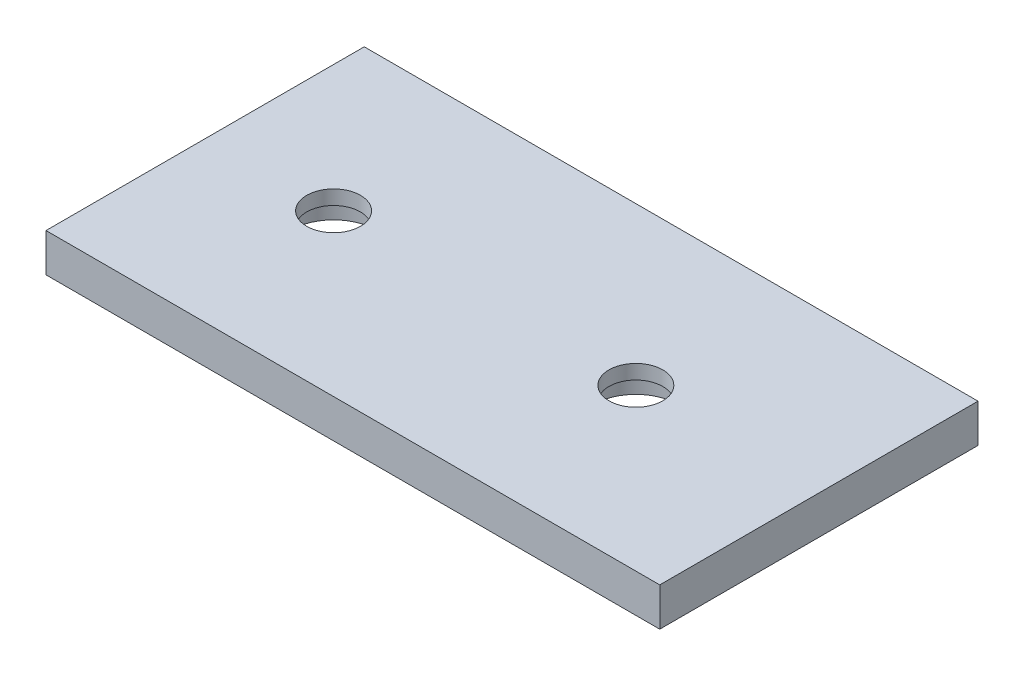
ISO-10303-21;
HEADER;
FILE_DESCRIPTION(('STEP AP214'),'2;1');
FILE_NAME('part.step','',(''),(''),'','','');
FILE_SCHEMA(('AUTOMOTIVE_DESIGN { 1 0 10303 214 1 1 1 1 }'));
ENDSEC;
DATA;
#1=APPLICATION_CONTEXT('core data for automotive mechanical design processes');
#2=APPLICATION_PROTOCOL_DEFINITION('international standard','automotive_design',2000,#1);
#3=PRODUCT_CONTEXT('',#1,'mechanical');
#4=PRODUCT('Part','Part','',(#3));
#5=PRODUCT_RELATED_PRODUCT_CATEGORY('part','',(#4));
#6=PRODUCT_DEFINITION_FORMATION('','',#4);
#7=PRODUCT_DEFINITION_CONTEXT('part definition',#1,'design');
#8=PRODUCT_DEFINITION('design','',#6,#7);
#9=PRODUCT_DEFINITION_SHAPE('','',#8);
#10=(LENGTH_UNIT() NAMED_UNIT(*) SI_UNIT(.MILLI.,.METRE.));
#11=(NAMED_UNIT(*) PLANE_ANGLE_UNIT() SI_UNIT($,.RADIAN.));
#12=(NAMED_UNIT(*) SI_UNIT($,.STERADIAN.) SOLID_ANGLE_UNIT());
#13=UNCERTAINTY_MEASURE_WITH_UNIT(LENGTH_MEASURE(1.E-05),#10,'distance_accuracy_value','');
#14=(GEOMETRIC_REPRESENTATION_CONTEXT(3) GLOBAL_UNCERTAINTY_ASSIGNED_CONTEXT((#13)) GLOBAL_UNIT_ASSIGNED_CONTEXT((#10,
#11,#12)) REPRESENTATION_CONTEXT('',''));
#15=CARTESIAN_POINT('',(0.,0.,0.));
#16=DIRECTION('',(0.,0.,1.));
#17=DIRECTION('',(1.,0.,0.));
#18=AXIS2_PLACEMENT_3D('',#15,#16,#17);
#19=CARTESIAN_POINT('',(61.1264723937618,12.7,0.));
#20=DIRECTION('',(1.,0.,0.));
#21=DIRECTION('',(0.,0.,-1.));
#22=AXIS2_PLACEMENT_3D('',#19,#20,#21);
#23=PLANE('',#22);
#24=DIRECTION('',(0.,0.,1.));
#25=VECTOR('',#24,1.);
#26=CARTESIAN_POINT('',(61.1264723937618,0.,0.));
#27=LINE('',#26,#25);
#28=CARTESIAN_POINT('',(61.1264723937618,0.,-52.0635569284407));
#29=VERTEX_POINT('',#28);
#30=CARTESIAN_POINT('',(61.1264723937618,0.,53.2205248601838));
#31=VERTEX_POINT('',#30);
#32=EDGE_CURVE('E108',#29,#31,#27,.T.);
#33=ORIENTED_EDGE('',*,*,#32,.F.);
#34=DIRECTION('',(0.,-1.,0.));
#35=VECTOR('',#34,1.);
#36=CARTESIAN_POINT('',(61.1264723937618,12.7,-52.0635569284407));
#37=LINE('',#36,#35);
#38=CARTESIAN_POINT('',(61.1264723937618,12.7,-52.0635569284407));
#39=VERTEX_POINT('',#38);
#40=EDGE_CURVE('E11',#39,#29,#37,.T.);
#41=ORIENTED_EDGE('',*,*,#40,.F.);
#42=DIRECTION('',(0.,0.,1.));
#43=VECTOR('',#42,1.);
#44=CARTESIAN_POINT('',(61.1264723937618,12.7,0.));
#45=LINE('',#44,#43);
#46=CARTESIAN_POINT('',(61.1264723937618,12.7,53.2205248601838));
#47=VERTEX_POINT('',#46);
#48=EDGE_CURVE('E101',#39,#47,#45,.T.);
#49=ORIENTED_EDGE('',*,*,#48,.T.);
#50=DIRECTION('',(0.,-1.,0.));
#51=VECTOR('',#50,1.);
#52=CARTESIAN_POINT('',(61.1264723937618,12.7,53.2205248601838));
#53=LINE('',#52,#51);
#54=EDGE_CURVE('E79',#47,#31,#53,.T.);
#55=ORIENTED_EDGE('',*,*,#54,.T.);
#56=EDGE_LOOP('',(#33,#41,#49,#55));
#57=FACE_BOUND('',#56,.T.);
#58=ADVANCED_FACE('F37',(#57),#23,.T.);
#59=CARTESIAN_POINT('',(0.,12.7,-52.0635569284407));
#60=DIRECTION('',(0.,0.,-1.));
#61=DIRECTION('',(-1.,0.,0.));
#62=AXIS2_PLACEMENT_3D('',#59,#60,#61);
#63=PLANE('',#62);
#64=DIRECTION('',(1.,0.,0.));
#65=VECTOR('',#64,1.);
#66=CARTESIAN_POINT('',(0.,0.,-52.0635569284407));
#67=LINE('',#66,#65);
#68=CARTESIAN_POINT('',(-141.921399627157,0.,-52.0635569284407));
#69=VERTEX_POINT('',#68);
#70=EDGE_CURVE('E91',#69,#29,#67,.T.);
#71=ORIENTED_EDGE('',*,*,#70,.F.);
#72=DIRECTION('',(0.,-1.,0.));
#73=VECTOR('',#72,1.);
#74=CARTESIAN_POINT('',(-141.921399627157,12.7,-52.0635569284407));
#75=LINE('',#74,#73);
#76=CARTESIAN_POINT('',(-141.921399627157,12.7,-52.0635569284407));
#77=VERTEX_POINT('',#76);
#78=EDGE_CURVE('E47',#77,#69,#75,.T.);
#79=ORIENTED_EDGE('',*,*,#78,.F.);
#80=DIRECTION('',(1.,0.,0.));
#81=VECTOR('',#80,1.);
#82=CARTESIAN_POINT('',(0.,12.7,-52.0635569284407));
#83=LINE('',#82,#81);
#84=EDGE_CURVE('E89',#77,#39,#83,.T.);
#85=ORIENTED_EDGE('',*,*,#84,.T.);
#86=ORIENTED_EDGE('',*,*,#40,.T.);
#87=EDGE_LOOP('',(#71,#79,#85,#86));
#88=FACE_BOUND('',#87,.T.);
#89=ADVANCED_FACE('F87',(#88),#63,.T.);
#90=CARTESIAN_POINT('',(-141.921399627157,12.7,0.));
#91=DIRECTION('',(1.,0.,0.));
#92=DIRECTION('',(0.,0.,-1.));
#93=AXIS2_PLACEMENT_3D('',#90,#91,#92);
#94=PLANE('',#93);
#95=DIRECTION('',(0.,0.,1.));
#96=VECTOR('',#95,1.);
#97=CARTESIAN_POINT('',(-141.921399627157,0.,0.));
#98=LINE('',#97,#96);
#99=CARTESIAN_POINT('',(-141.921399627157,0.,53.2205248601838));
#100=VERTEX_POINT('',#99);
#101=EDGE_CURVE('E111',#69,#100,#98,.T.);
#102=ORIENTED_EDGE('',*,*,#101,.T.);
#103=DIRECTION('',(0.,-1.,0.));
#104=VECTOR('',#103,1.);
#105=CARTESIAN_POINT('',(-141.921399627157,12.7,53.2205248601838));
#106=LINE('',#105,#104);
#107=CARTESIAN_POINT('',(-141.921399627157,12.7,53.2205248601838));
#108=VERTEX_POINT('',#107);
#109=EDGE_CURVE('E94',#108,#100,#106,.T.);
#110=ORIENTED_EDGE('',*,*,#109,.F.);
#111=DIRECTION('',(0.,0.,1.));
#112=VECTOR('',#111,1.);
#113=CARTESIAN_POINT('',(-141.921399627157,12.7,0.));
#114=LINE('',#113,#112);
#115=EDGE_CURVE('E97',#77,#108,#114,.T.);
#116=ORIENTED_EDGE('',*,*,#115,.F.);
#117=ORIENTED_EDGE('',*,*,#78,.T.);
#118=EDGE_LOOP('',(#102,#110,#116,#117));
#119=FACE_BOUND('',#118,.T.);
#120=ADVANCED_FACE('F98',(#119),#94,.F.);
#121=CARTESIAN_POINT('',(-100.,12.7,0.));
#122=DIRECTION('',(0.,-1.,0.));
#123=DIRECTION('',(0.,0.,-1.));
#124=AXIS2_PLACEMENT_3D('',#121,#122,#123);
#125=CYLINDRICAL_SURFACE('',#124,8.88999999999999);
#126=CARTESIAN_POINT('',(-100.,7.9375,0.));
#127=DIRECTION('',(0.,1.,0.));
#128=DIRECTION('',(0.,0.,1.));
#129=AXIS2_PLACEMENT_3D('',#126,#127,#128);
#130=CIRCLE('',#129,8.88999999999999);
#131=CARTESIAN_POINT('',(-100.,7.9375,8.88999999999999));
#132=VERTEX_POINT('',#131);
#133=EDGE_CURVE('E41',#132,#132,#130,.T.);
#134=ORIENTED_EDGE('',*,*,#133,.F.);
#135=EDGE_LOOP('',(#134));
#136=FACE_BOUND('',#135,.T.);
#137=CARTESIAN_POINT('',(-100.,12.7,0.));
#138=DIRECTION('',(0.,1.,0.));
#139=DIRECTION('',(0.,0.,1.));
#140=AXIS2_PLACEMENT_3D('',#137,#138,#139);
#141=CIRCLE('',#140,8.88999999999999);
#142=CARTESIAN_POINT('',(-100.,12.7,8.88999999999999));
#143=VERTEX_POINT('',#142);
#144=EDGE_CURVE('E103',#143,#143,#141,.T.);
#145=ORIENTED_EDGE('',*,*,#144,.T.);
#146=EDGE_LOOP('',(#145));
#147=FACE_BOUND('',#146,.T.);
#148=ADVANCED_FACE('F140',(#136,#147),#125,.F.);
#149=CARTESIAN_POINT('',(0.,12.7,0.));
#150=DIRECTION('',(0.,-1.,0.));
#151=DIRECTION('',(0.,0.,-1.));
#152=AXIS2_PLACEMENT_3D('',#149,#150,#151);
#153=CYLINDRICAL_SURFACE('',#152,8.89);
#154=CARTESIAN_POINT('',(0.,7.9375,0.));
#155=DIRECTION('',(0.,1.,0.));
#156=DIRECTION('',(0.,0.,1.));
#157=AXIS2_PLACEMENT_3D('',#154,#155,#156);
#158=CIRCLE('',#157,8.89);
#159=CARTESIAN_POINT('',(0.,7.9375,8.89));
#160=VERTEX_POINT('',#159);
#161=EDGE_CURVE('E116',#160,#160,#158,.T.);
#162=ORIENTED_EDGE('',*,*,#161,.F.);
#163=EDGE_LOOP('',(#162));
#164=FACE_BOUND('',#163,.T.);
#165=CARTESIAN_POINT('',(0.,12.7,0.));
#166=DIRECTION('',(0.,1.,0.));
#167=DIRECTION('',(0.,0.,1.));
#168=AXIS2_PLACEMENT_3D('',#165,#166,#167);
#169=CIRCLE('',#168,8.89);
#170=CARTESIAN_POINT('',(0.,12.7,8.89));
#171=VERTEX_POINT('',#170);
#172=EDGE_CURVE('E114',#171,#171,#169,.T.);
#173=ORIENTED_EDGE('',*,*,#172,.T.);
#174=EDGE_LOOP('',(#173));
#175=FACE_BOUND('',#174,.T.);
#176=ADVANCED_FACE('F39',(#164,#175),#153,.F.);
#177=CARTESIAN_POINT('',(0.,12.7,53.2205248601838));
#178=DIRECTION('',(0.,0.,-1.));
#179=DIRECTION('',(-1.,0.,0.));
#180=AXIS2_PLACEMENT_3D('',#177,#178,#179);
#181=PLANE('',#180);
#182=DIRECTION('',(1.,0.,0.));
#183=VECTOR('',#182,1.);
#184=CARTESIAN_POINT('',(0.,0.,53.2205248601838));
#185=LINE('',#184,#183);
#186=EDGE_CURVE('E72',#100,#31,#185,.T.);
#187=ORIENTED_EDGE('',*,*,#186,.T.);
#188=ORIENTED_EDGE('',*,*,#54,.F.);
#189=DIRECTION('',(1.,0.,0.));
#190=VECTOR('',#189,1.);
#191=CARTESIAN_POINT('',(0.,12.7,53.2205248601838));
#192=LINE('',#191,#190);
#193=EDGE_CURVE('E56',#108,#47,#192,.T.);
#194=ORIENTED_EDGE('',*,*,#193,.F.);
#195=ORIENTED_EDGE('',*,*,#109,.T.);
#196=EDGE_LOOP('',(#187,#188,#194,#195));
#197=FACE_BOUND('',#196,.T.);
#198=ADVANCED_FACE('F144',(#197),#181,.F.);
#199=CARTESIAN_POINT('',(0.,12.7,0.));
#200=DIRECTION('',(0.,1.,0.));
#201=DIRECTION('',(0.,0.,1.));
#202=AXIS2_PLACEMENT_3D('',#199,#200,#201);
#203=PLANE('',#202);
#204=ORIENTED_EDGE('',*,*,#172,.F.);
#205=EDGE_LOOP('',(#204));
#206=FACE_BOUND('',#205,.T.);
#207=ORIENTED_EDGE('',*,*,#144,.F.);
#208=EDGE_LOOP('',(#207));
#209=FACE_BOUND('',#208,.T.);
#210=ORIENTED_EDGE('',*,*,#48,.F.);
#211=ORIENTED_EDGE('',*,*,#84,.F.);
#212=ORIENTED_EDGE('',*,*,#115,.T.);
#213=ORIENTED_EDGE('',*,*,#193,.T.);
#214=EDGE_LOOP('',(#210,#211,#212,#213));
#215=FACE_BOUND('',#214,.T.);
#216=ADVANCED_FACE('F100',(#206,#209,#215),#203,.T.);
#217=CARTESIAN_POINT('',(0.,0.,0.));
#218=DIRECTION('',(0.,1.,0.));
#219=DIRECTION('',(0.,0.,1.));
#220=AXIS2_PLACEMENT_3D('',#217,#218,#219);
#221=PLANE('',#220);
#222=CARTESIAN_POINT('',(-100.,0.,0.));
#223=DIRECTION('',(0.,1.,0.));
#224=DIRECTION('',(0.,0.,1.));
#225=AXIS2_PLACEMENT_3D('',#222,#223,#224);
#226=CIRCLE('',#225,14.2875);
#227=CARTESIAN_POINT('',(-100.,0.,14.2875));
#228=VERTEX_POINT('',#227);
#229=EDGE_CURVE('E123',#228,#228,#226,.T.);
#230=ORIENTED_EDGE('',*,*,#229,.T.);
#231=EDGE_LOOP('',(#230));
#232=FACE_BOUND('',#231,.T.);
#233=CARTESIAN_POINT('',(0.,0.,0.));
#234=DIRECTION('',(0.,1.,0.));
#235=DIRECTION('',(0.,0.,1.));
#236=AXIS2_PLACEMENT_3D('',#233,#234,#235);
#237=CIRCLE('',#236,14.2875);
#238=CARTESIAN_POINT('',(0.,0.,14.2875));
#239=VERTEX_POINT('',#238);
#240=EDGE_CURVE('E133',#239,#239,#237,.T.);
#241=ORIENTED_EDGE('',*,*,#240,.T.);
#242=EDGE_LOOP('',(#241));
#243=FACE_BOUND('',#242,.T.);
#244=ORIENTED_EDGE('',*,*,#32,.T.);
#245=ORIENTED_EDGE('',*,*,#186,.F.);
#246=ORIENTED_EDGE('',*,*,#101,.F.);
#247=ORIENTED_EDGE('',*,*,#70,.T.);
#248=EDGE_LOOP('',(#244,#245,#246,#247));
#249=FACE_BOUND('',#248,.T.);
#250=ADVANCED_FACE('F143',(#232,#243,#249),#221,.F.);
#251=CARTESIAN_POINT('',(0.,7.9375,0.));
#252=DIRECTION('',(0.,-1.,0.));
#253=DIRECTION('',(0.,0.,-1.));
#254=AXIS2_PLACEMENT_3D('',#251,#252,#253);
#255=CYLINDRICAL_SURFACE('',#254,14.2875);
#256=CARTESIAN_POINT('',(0.,7.9375,0.));
#257=DIRECTION('',(0.,1.,0.));
#258=DIRECTION('',(0.,0.,1.));
#259=AXIS2_PLACEMENT_3D('',#256,#257,#258);
#260=CIRCLE('',#259,14.2875);
#261=CARTESIAN_POINT('',(0.,7.9375,14.2875));
#262=VERTEX_POINT('',#261);
#263=EDGE_CURVE('E128',#262,#262,#260,.T.);
#264=ORIENTED_EDGE('',*,*,#263,.T.);
#265=EDGE_LOOP('',(#264));
#266=FACE_BOUND('',#265,.T.);
#267=ORIENTED_EDGE('',*,*,#240,.F.);
#268=EDGE_LOOP('',(#267));
#269=FACE_BOUND('',#268,.T.);
#270=ADVANCED_FACE('F151',(#266,#269),#255,.F.);
#271=CARTESIAN_POINT('',(0.,7.9375,0.));
#272=DIRECTION('',(0.,1.,0.));
#273=DIRECTION('',(0.,0.,1.));
#274=AXIS2_PLACEMENT_3D('',#271,#272,#273);
#275=PLANE('',#274);
#276=ORIENTED_EDGE('',*,*,#161,.T.);
#277=EDGE_LOOP('',(#276));
#278=FACE_BOUND('',#277,.T.);
#279=ORIENTED_EDGE('',*,*,#263,.F.);
#280=EDGE_LOOP('',(#279));
#281=FACE_BOUND('',#280,.T.);
#282=ADVANCED_FACE('F182',(#278,#281),#275,.F.);
#283=CARTESIAN_POINT('',(-100.,7.9375,0.));
#284=DIRECTION('',(0.,-1.,0.));
#285=DIRECTION('',(0.,0.,-1.));
#286=AXIS2_PLACEMENT_3D('',#283,#284,#285);
#287=CYLINDRICAL_SURFACE('',#286,14.2875);
#288=CARTESIAN_POINT('',(-100.,7.9375,0.));
#289=DIRECTION('',(0.,1.,0.));
#290=DIRECTION('',(0.,0.,1.));
#291=AXIS2_PLACEMENT_3D('',#288,#289,#290);
#292=CIRCLE('',#291,14.2875);
#293=CARTESIAN_POINT('',(-100.,7.9375,14.2875));
#294=VERTEX_POINT('',#293);
#295=EDGE_CURVE('E118',#294,#294,#292,.T.);
#296=ORIENTED_EDGE('',*,*,#295,.T.);
#297=EDGE_LOOP('',(#296));
#298=FACE_BOUND('',#297,.T.);
#299=ORIENTED_EDGE('',*,*,#229,.F.);
#300=EDGE_LOOP('',(#299));
#301=FACE_BOUND('',#300,.T.);
#302=ADVANCED_FACE('F177',(#298,#301),#287,.F.);
#303=CARTESIAN_POINT('',(-100.,7.9375,0.));
#304=DIRECTION('',(0.,1.,0.));
#305=DIRECTION('',(0.,0.,1.));
#306=AXIS2_PLACEMENT_3D('',#303,#304,#305);
#307=PLANE('',#306);
#308=ORIENTED_EDGE('',*,*,#133,.T.);
#309=EDGE_LOOP('',(#308));
#310=FACE_BOUND('',#309,.T.);
#311=ORIENTED_EDGE('',*,*,#295,.F.);
#312=EDGE_LOOP('',(#311));
#313=FACE_BOUND('',#312,.T.);
#314=ADVANCED_FACE('F174',(#310,#313),#307,.F.);
#315=CLOSED_SHELL('',(#58,#89,#120,#148,#176,#198,#216,#250,#270,#282,#302,#314));
#316=MANIFOLD_SOLID_BREP('B2',#315);
#317=ADVANCED_BREP_SHAPE_REPRESENTATION('',(#18,#316),#14);
#318=SHAPE_DEFINITION_REPRESENTATION(#9,#317);
ENDSEC;
END-ISO-10303-21;
